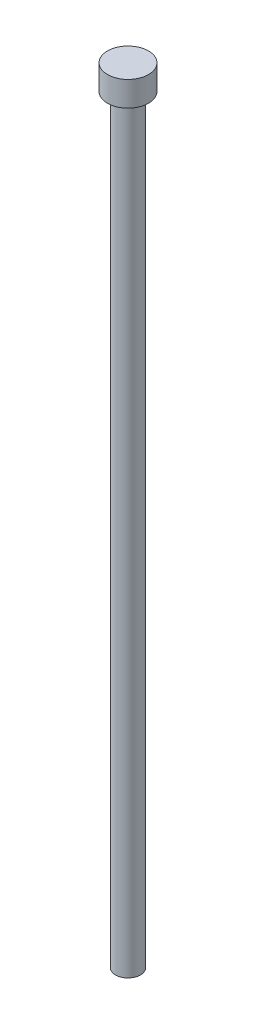
ISO-10303-21;
HEADER;
FILE_DESCRIPTION(('STEP AP214'),'2;1');
FILE_NAME('part.step','',(''),(''),'','','');
FILE_SCHEMA(('AUTOMOTIVE_DESIGN { 1 0 10303 214 1 1 1 1 }'));
ENDSEC;
DATA;
#1=APPLICATION_CONTEXT('core data for automotive mechanical design processes');
#2=APPLICATION_PROTOCOL_DEFINITION('international standard','automotive_design',2000,#1);
#3=PRODUCT_CONTEXT('',#1,'mechanical');
#4=PRODUCT('Part','Part','',(#3));
#5=PRODUCT_RELATED_PRODUCT_CATEGORY('part','',(#4));
#6=PRODUCT_DEFINITION_FORMATION('','',#4);
#7=PRODUCT_DEFINITION_CONTEXT('part definition',#1,'design');
#8=PRODUCT_DEFINITION('design','',#6,#7);
#9=PRODUCT_DEFINITION_SHAPE('','',#8);
#10=(LENGTH_UNIT() NAMED_UNIT(*) SI_UNIT(.MILLI.,.METRE.));
#11=(NAMED_UNIT(*) PLANE_ANGLE_UNIT() SI_UNIT($,.RADIAN.));
#12=(NAMED_UNIT(*) SI_UNIT($,.STERADIAN.) SOLID_ANGLE_UNIT());
#13=UNCERTAINTY_MEASURE_WITH_UNIT(LENGTH_MEASURE(1.E-05),#10,'distance_accuracy_value','');
#14=(GEOMETRIC_REPRESENTATION_CONTEXT(3) GLOBAL_UNCERTAINTY_ASSIGNED_CONTEXT((#13)) GLOBAL_UNIT_ASSIGNED_CONTEXT((#10,
#11,#12)) REPRESENTATION_CONTEXT('',''));
#15=CARTESIAN_POINT('',(0.,0.,0.));
#16=DIRECTION('',(0.,0.,1.));
#17=DIRECTION('',(1.,0.,0.));
#18=AXIS2_PLACEMENT_3D('',#15,#16,#17);
#19=CARTESIAN_POINT('',(0.,4.1656,0.));
#20=DIRECTION('',(0.,-1.,0.));
#21=DIRECTION('',(0.,0.,-1.));
#22=AXIS2_PLACEMENT_3D('',#19,#20,#21);
#23=CYLINDRICAL_SURFACE('',#22,3.429);
#24=CARTESIAN_POINT('',(0.,4.1656,0.));
#25=DIRECTION('',(0.,1.,0.));
#26=DIRECTION('',(0.,0.,1.));
#27=AXIS2_PLACEMENT_3D('',#24,#25,#26);
#28=CIRCLE('',#27,3.429);
#29=CARTESIAN_POINT('',(0.,4.1656,3.429));
#30=VERTEX_POINT('',#29);
#31=EDGE_CURVE('E38',#30,#30,#28,.T.);
#32=ORIENTED_EDGE('',*,*,#31,.F.);
#33=EDGE_LOOP('',(#32));
#34=FACE_BOUND('',#33,.T.);
#35=CARTESIAN_POINT('',(0.,0.,0.));
#36=DIRECTION('',(0.,1.,0.));
#37=DIRECTION('',(0.,0.,1.));
#38=AXIS2_PLACEMENT_3D('',#35,#36,#37);
#39=CIRCLE('',#38,3.429);
#40=CARTESIAN_POINT('',(0.,0.,3.429));
#41=VERTEX_POINT('',#40);
#42=EDGE_CURVE('E34',#41,#41,#39,.T.);
#43=ORIENTED_EDGE('',*,*,#42,.T.);
#44=EDGE_LOOP('',(#43));
#45=FACE_BOUND('',#44,.T.);
#46=ADVANCED_FACE('F31',(#34,#45),#23,.T.);
#47=CARTESIAN_POINT('',(0.,4.1656,0.));
#48=DIRECTION('',(0.,1.,0.));
#49=DIRECTION('',(0.,0.,1.));
#50=AXIS2_PLACEMENT_3D('',#47,#48,#49);
#51=PLANE('',#50);
#52=ORIENTED_EDGE('',*,*,#31,.T.);
#53=EDGE_LOOP('',(#52));
#54=FACE_BOUND('',#53,.T.);
#55=ADVANCED_FACE('F55',(#54),#51,.T.);
#56=CARTESIAN_POINT('',(0.,0.,0.));
#57=DIRECTION('',(0.,1.,0.));
#58=DIRECTION('',(0.,0.,1.));
#59=AXIS2_PLACEMENT_3D('',#56,#57,#58);
#60=PLANE('',#59);
#61=CARTESIAN_POINT('',(0.,0.,0.));
#62=DIRECTION('',(0.,-1.,0.));
#63=DIRECTION('',(0.,0.,-1.));
#64=AXIS2_PLACEMENT_3D('',#61,#62,#63);
#65=CIRCLE('',#64,2.0828);
#66=CARTESIAN_POINT('',(0.,0.,-2.0828));
#67=VERTEX_POINT('',#66);
#68=EDGE_CURVE('E10',#67,#67,#65,.T.);
#69=ORIENTED_EDGE('',*,*,#68,.F.);
#70=EDGE_LOOP('',(#69));
#71=FACE_BOUND('',#70,.T.);
#72=ORIENTED_EDGE('',*,*,#42,.F.);
#73=EDGE_LOOP('',(#72));
#74=FACE_BOUND('',#73,.T.);
#75=ADVANCED_FACE('F52',(#71,#74),#60,.F.);
#76=CARTESIAN_POINT('',(0.,-127.,0.));
#77=DIRECTION('',(0.,1.,0.));
#78=DIRECTION('',(0.,0.,1.));
#79=AXIS2_PLACEMENT_3D('',#76,#77,#78);
#80=CYLINDRICAL_SURFACE('',#79,2.0828);
#81=CARTESIAN_POINT('',(0.,-127.,0.));
#82=DIRECTION('',(0.,-1.,0.));
#83=DIRECTION('',(0.,0.,-1.));
#84=AXIS2_PLACEMENT_3D('',#81,#82,#83);
#85=CIRCLE('',#84,2.0828);
#86=CARTESIAN_POINT('',(0.,-127.,-2.0828));
#87=VERTEX_POINT('',#86);
#88=EDGE_CURVE('E44',#87,#87,#85,.T.);
#89=ORIENTED_EDGE('',*,*,#88,.F.);
#90=EDGE_LOOP('',(#89));
#91=FACE_BOUND('',#90,.T.);
#92=ORIENTED_EDGE('',*,*,#68,.T.);
#93=EDGE_LOOP('',(#92));
#94=FACE_BOUND('',#93,.T.);
#95=ADVANCED_FACE('F54',(#91,#94),#80,.T.);
#96=CARTESIAN_POINT('',(0.,-127.,0.));
#97=DIRECTION('',(0.,-1.,0.));
#98=DIRECTION('',(0.,0.,-1.));
#99=AXIS2_PLACEMENT_3D('',#96,#97,#98);
#100=PLANE('',#99);
#101=ORIENTED_EDGE('',*,*,#88,.T.);
#102=EDGE_LOOP('',(#101));
#103=FACE_BOUND('',#102,.T.);
#104=ADVANCED_FACE('F61',(#103),#100,.T.);
#105=CLOSED_SHELL('',(#46,#55,#75,#95,#104));
#106=MANIFOLD_SOLID_BREP('B2',#105);
#107=ADVANCED_BREP_SHAPE_REPRESENTATION('',(#18,#106),#14);
#108=SHAPE_DEFINITION_REPRESENTATION(#9,#107);
ENDSEC;
END-ISO-10303-21;
